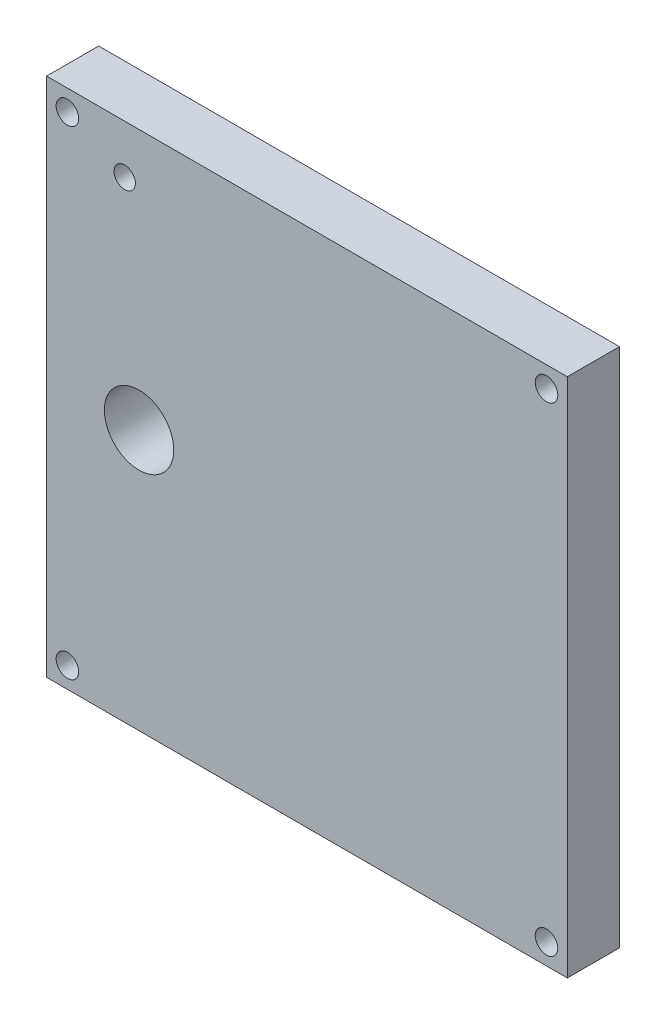
ISO-10303-21;
HEADER;
FILE_DESCRIPTION(('STEP AP214'),'2;1');
FILE_NAME('part.step','',(''),(''),'','','');
FILE_SCHEMA(('AUTOMOTIVE_DESIGN { 1 0 10303 214 1 1 1 1 }'));
ENDSEC;
DATA;
#1=APPLICATION_CONTEXT('core data for automotive mechanical design processes');
#2=APPLICATION_PROTOCOL_DEFINITION('international standard','automotive_design',2000,#1);
#3=PRODUCT_CONTEXT('',#1,'mechanical');
#4=PRODUCT('Part','Part','',(#3));
#5=PRODUCT_RELATED_PRODUCT_CATEGORY('part','',(#4));
#6=PRODUCT_DEFINITION_FORMATION('','',#4);
#7=PRODUCT_DEFINITION_CONTEXT('part definition',#1,'design');
#8=PRODUCT_DEFINITION('design','',#6,#7);
#9=PRODUCT_DEFINITION_SHAPE('','',#8);
#10=(LENGTH_UNIT() NAMED_UNIT(*) SI_UNIT(.MILLI.,.METRE.));
#11=(NAMED_UNIT(*) PLANE_ANGLE_UNIT() SI_UNIT($,.RADIAN.));
#12=(NAMED_UNIT(*) SI_UNIT($,.STERADIAN.) SOLID_ANGLE_UNIT());
#13=UNCERTAINTY_MEASURE_WITH_UNIT(LENGTH_MEASURE(1.E-05),#10,'distance_accuracy_value','');
#14=(GEOMETRIC_REPRESENTATION_CONTEXT(3) GLOBAL_UNCERTAINTY_ASSIGNED_CONTEXT((#13)) GLOBAL_UNIT_ASSIGNED_CONTEXT((#10,
#11,#12)) REPRESENTATION_CONTEXT('',''));
#15=CARTESIAN_POINT('',(0.,0.,0.));
#16=DIRECTION('',(0.,0.,1.));
#17=DIRECTION('',(1.,0.,0.));
#18=AXIS2_PLACEMENT_3D('',#15,#16,#17);
#19=CARTESIAN_POINT('',(75.,75.,7.5));
#20=DIRECTION('',(-1.,0.,0.));
#21=DIRECTION('',(0.,-1.,0.));
#22=AXIS2_PLACEMENT_3D('',#19,#20,#21);
#23=PLANE('',#22);
#24=DIRECTION('',(0.,1.,0.));
#25=VECTOR('',#24,1.);
#26=CARTESIAN_POINT('',(75.,75.,-7.5));
#27=LINE('',#26,#25);
#28=CARTESIAN_POINT('',(75.,-75.,-7.5));
#29=VERTEX_POINT('',#28);
#30=CARTESIAN_POINT('',(75.,75.,-7.5));
#31=VERTEX_POINT('',#30);
#32=EDGE_CURVE('E97',#29,#31,#27,.T.);
#33=ORIENTED_EDGE('',*,*,#32,.T.);
#34=DIRECTION('',(0.,0.,-1.));
#35=VECTOR('',#34,1.);
#36=CARTESIAN_POINT('',(75.,75.,7.5));
#37=LINE('',#36,#35);
#38=CARTESIAN_POINT('',(75.,75.,7.5));
#39=VERTEX_POINT('',#38);
#40=EDGE_CURVE('E11',#39,#31,#37,.T.);
#41=ORIENTED_EDGE('',*,*,#40,.F.);
#42=DIRECTION('',(0.,1.,0.));
#43=VECTOR('',#42,1.);
#44=CARTESIAN_POINT('',(75.,75.,7.5));
#45=LINE('',#44,#43);
#46=CARTESIAN_POINT('',(75.,-75.,7.5));
#47=VERTEX_POINT('',#46);
#48=EDGE_CURVE('E84',#47,#39,#45,.T.);
#49=ORIENTED_EDGE('',*,*,#48,.F.);
#50=DIRECTION('',(0.,0.,-1.));
#51=VECTOR('',#50,1.);
#52=CARTESIAN_POINT('',(75.,-75.,7.5));
#53=LINE('',#52,#51);
#54=EDGE_CURVE('E93',#47,#29,#53,.T.);
#55=ORIENTED_EDGE('',*,*,#54,.T.);
#56=EDGE_LOOP('',(#33,#41,#49,#55));
#57=FACE_BOUND('',#56,.T.);
#58=ADVANCED_FACE('F32',(#57),#23,.F.);
#59=CARTESIAN_POINT('',(-75.,75.,7.5));
#60=DIRECTION('',(0.,-1.,0.));
#61=DIRECTION('',(0.,0.,-1.));
#62=AXIS2_PLACEMENT_3D('',#59,#60,#61);
#63=PLANE('',#62);
#64=DIRECTION('',(-1.,0.,0.));
#65=VECTOR('',#64,1.);
#66=CARTESIAN_POINT('',(-75.,75.,-7.5));
#67=LINE('',#66,#65);
#68=CARTESIAN_POINT('',(-75.,75.,-7.5));
#69=VERTEX_POINT('',#68);
#70=EDGE_CURVE('E88',#31,#69,#67,.T.);
#71=ORIENTED_EDGE('',*,*,#70,.T.);
#72=DIRECTION('',(0.,0.,-1.));
#73=VECTOR('',#72,1.);
#74=CARTESIAN_POINT('',(-75.,75.,7.5));
#75=LINE('',#74,#73);
#76=CARTESIAN_POINT('',(-75.,75.,7.5));
#77=VERTEX_POINT('',#76);
#78=EDGE_CURVE('E41',#77,#69,#75,.T.);
#79=ORIENTED_EDGE('',*,*,#78,.F.);
#80=DIRECTION('',(-1.,0.,0.));
#81=VECTOR('',#80,1.);
#82=CARTESIAN_POINT('',(-75.,75.,7.5));
#83=LINE('',#82,#81);
#84=EDGE_CURVE('E79',#39,#77,#83,.T.);
#85=ORIENTED_EDGE('',*,*,#84,.F.);
#86=ORIENTED_EDGE('',*,*,#40,.T.);
#87=EDGE_LOOP('',(#71,#79,#85,#86));
#88=FACE_BOUND('',#87,.T.);
#89=ADVANCED_FACE('F87',(#88),#63,.F.);
#90=CARTESIAN_POINT('',(-75.,75.,7.5));
#91=DIRECTION('',(1.,0.,0.));
#92=DIRECTION('',(0.,1.,0.));
#93=AXIS2_PLACEMENT_3D('',#90,#91,#92);
#94=PLANE('',#93);
#95=DIRECTION('',(0.,-1.,0.));
#96=VECTOR('',#95,1.);
#97=CARTESIAN_POINT('',(-75.,75.,-7.5));
#98=LINE('',#97,#96);
#99=CARTESIAN_POINT('',(-75.,-75.,-7.5));
#100=VERTEX_POINT('',#99);
#101=EDGE_CURVE('E66',#69,#100,#98,.T.);
#102=ORIENTED_EDGE('',*,*,#101,.T.);
#103=DIRECTION('',(0.,0.,-1.));
#104=VECTOR('',#103,1.);
#105=CARTESIAN_POINT('',(-75.,-75.,7.5));
#106=LINE('',#105,#104);
#107=CARTESIAN_POINT('',(-75.,-75.,7.5));
#108=VERTEX_POINT('',#107);
#109=EDGE_CURVE('E89',#108,#100,#106,.T.);
#110=ORIENTED_EDGE('',*,*,#109,.F.);
#111=DIRECTION('',(0.,-1.,0.));
#112=VECTOR('',#111,1.);
#113=CARTESIAN_POINT('',(-75.,75.,7.5));
#114=LINE('',#113,#112);
#115=EDGE_CURVE('E82',#77,#108,#114,.T.);
#116=ORIENTED_EDGE('',*,*,#115,.F.);
#117=ORIENTED_EDGE('',*,*,#78,.T.);
#118=EDGE_LOOP('',(#102,#110,#116,#117));
#119=FACE_BOUND('',#118,.T.);
#120=ADVANCED_FACE('F91',(#119),#94,.F.);
#121=CARTESIAN_POINT('',(-75.,-75.,7.5));
#122=DIRECTION('',(0.,1.,0.));
#123=DIRECTION('',(0.,0.,1.));
#124=AXIS2_PLACEMENT_3D('',#121,#122,#123);
#125=PLANE('',#124);
#126=DIRECTION('',(1.,0.,0.));
#127=VECTOR('',#126,1.);
#128=CARTESIAN_POINT('',(-75.,-75.,-7.5));
#129=LINE('',#128,#127);
#130=EDGE_CURVE('E72',#100,#29,#129,.T.);
#131=ORIENTED_EDGE('',*,*,#130,.T.);
#132=ORIENTED_EDGE('',*,*,#54,.F.);
#133=DIRECTION('',(1.,0.,0.));
#134=VECTOR('',#133,1.);
#135=CARTESIAN_POINT('',(-75.,-75.,7.5));
#136=LINE('',#135,#134);
#137=EDGE_CURVE('E49',#108,#47,#136,.T.);
#138=ORIENTED_EDGE('',*,*,#137,.F.);
#139=ORIENTED_EDGE('',*,*,#109,.T.);
#140=EDGE_LOOP('',(#131,#132,#138,#139));
#141=FACE_BOUND('',#140,.T.);
#142=ADVANCED_FACE('F105',(#141),#125,.F.);
#143=CARTESIAN_POINT('',(0.,0.,7.5));
#144=DIRECTION('',(0.,0.,1.));
#145=DIRECTION('',(1.,0.,0.));
#146=AXIS2_PLACEMENT_3D('',#143,#144,#145);
#147=PLANE('',#146);
#148=CARTESIAN_POINT('',(69.,69.,7.5));
#149=DIRECTION('',(0.,0.,1.));
#150=DIRECTION('',(1.,0.,0.));
#151=AXIS2_PLACEMENT_3D('',#148,#149,#150);
#152=CIRCLE('',#151,3.25000000000001);
#153=CARTESIAN_POINT('',(72.25,69.,7.5));
#154=VERTEX_POINT('',#153);
#155=EDGE_CURVE('E137',#154,#154,#152,.F.);
#156=ORIENTED_EDGE('',*,*,#155,.T.);
#157=EDGE_LOOP('',(#156));
#158=FACE_BOUND('',#157,.T.);
#159=CARTESIAN_POINT('',(69.,-69.,7.5));
#160=DIRECTION('',(0.,0.,1.));
#161=DIRECTION('',(1.,0.,0.));
#162=AXIS2_PLACEMENT_3D('',#159,#160,#161);
#163=CIRCLE('',#162,3.25000000000001);
#164=CARTESIAN_POINT('',(72.25,-69.,7.5));
#165=VERTEX_POINT('',#164);
#166=EDGE_CURVE('E131',#165,#165,#163,.T.);
#167=ORIENTED_EDGE('',*,*,#166,.F.);
#168=EDGE_LOOP('',(#167));
#169=FACE_BOUND('',#168,.T.);
#170=CARTESIAN_POINT('',(-69.,-69.,7.5));
#171=DIRECTION('',(0.,0.,1.));
#172=DIRECTION('',(1.,0.,0.));
#173=AXIS2_PLACEMENT_3D('',#170,#171,#172);
#174=CIRCLE('',#173,3.25000000000001);
#175=CARTESIAN_POINT('',(-65.75,-69.,7.5));
#176=VERTEX_POINT('',#175);
#177=EDGE_CURVE('E125',#176,#176,#174,.F.);
#178=ORIENTED_EDGE('',*,*,#177,.T.);
#179=EDGE_LOOP('',(#178));
#180=FACE_BOUND('',#179,.T.);
#181=CARTESIAN_POINT('',(-69.,69.,7.5));
#182=DIRECTION('',(0.,0.,1.));
#183=DIRECTION('',(1.,0.,0.));
#184=AXIS2_PLACEMENT_3D('',#181,#182,#183);
#185=CIRCLE('',#184,3.25000000000001);
#186=CARTESIAN_POINT('',(-65.75,69.,7.5));
#187=VERTEX_POINT('',#186);
#188=EDGE_CURVE('E119',#187,#187,#185,.T.);
#189=ORIENTED_EDGE('',*,*,#188,.F.);
#190=EDGE_LOOP('',(#189));
#191=FACE_BOUND('',#190,.T.);
#192=CARTESIAN_POINT('',(-48.3691097361927,0.,7.5));
#193=DIRECTION('',(0.,0.,1.));
#194=DIRECTION('',(1.,0.,0.));
#195=AXIS2_PLACEMENT_3D('',#192,#193,#194);
#196=CIRCLE('',#195,10.);
#197=CARTESIAN_POINT('',(-38.3691097361927,0.,7.5));
#198=VERTEX_POINT('',#197);
#199=EDGE_CURVE('E116',#198,#198,#196,.T.);
#200=ORIENTED_EDGE('',*,*,#199,.F.);
#201=EDGE_LOOP('',(#200));
#202=FACE_BOUND('',#201,.T.);
#203=CARTESIAN_POINT('',(-52.5,61.,7.5));
#204=DIRECTION('',(0.,0.,1.));
#205=DIRECTION('',(1.,0.,0.));
#206=AXIS2_PLACEMENT_3D('',#203,#204,#205);
#207=CIRCLE('',#206,3.075);
#208=CARTESIAN_POINT('',(-49.425,61.,7.5));
#209=VERTEX_POINT('',#208);
#210=EDGE_CURVE('E100',#209,#209,#207,.T.);
#211=ORIENTED_EDGE('',*,*,#210,.F.);
#212=EDGE_LOOP('',(#211));
#213=FACE_BOUND('',#212,.T.);
#214=ORIENTED_EDGE('',*,*,#48,.T.);
#215=ORIENTED_EDGE('',*,*,#84,.T.);
#216=ORIENTED_EDGE('',*,*,#115,.T.);
#217=ORIENTED_EDGE('',*,*,#137,.T.);
#218=EDGE_LOOP('',(#214,#215,#216,#217));
#219=FACE_BOUND('',#218,.T.);
#220=ADVANCED_FACE('F80',(#158,#169,#180,#191,#202,#213,#219),#147,.T.);
#221=CARTESIAN_POINT('',(0.,0.,-7.5));
#222=DIRECTION('',(0.,0.,1.));
#223=DIRECTION('',(1.,0.,0.));
#224=AXIS2_PLACEMENT_3D('',#221,#222,#223);
#225=PLANE('',#224);
#226=CARTESIAN_POINT('',(69.,69.,-7.5));
#227=DIRECTION('',(0.,0.,1.));
#228=DIRECTION('',(1.,0.,0.));
#229=AXIS2_PLACEMENT_3D('',#226,#227,#228);
#230=CIRCLE('',#229,3.25000000000001);
#231=CARTESIAN_POINT('',(72.25,69.,-7.5));
#232=VERTEX_POINT('',#231);
#233=EDGE_CURVE('E140',#232,#232,#230,.T.);
#234=ORIENTED_EDGE('',*,*,#233,.T.);
#235=EDGE_LOOP('',(#234));
#236=FACE_BOUND('',#235,.T.);
#237=CARTESIAN_POINT('',(69.,-69.,-7.5));
#238=DIRECTION('',(0.,0.,-1.));
#239=DIRECTION('',(1.,0.,0.));
#240=AXIS2_PLACEMENT_3D('',#237,#238,#239);
#241=CIRCLE('',#240,3.25000000000001);
#242=CARTESIAN_POINT('',(72.25,-69.,-7.5));
#243=VERTEX_POINT('',#242);
#244=EDGE_CURVE('E134',#243,#243,#241,.T.);
#245=ORIENTED_EDGE('',*,*,#244,.F.);
#246=EDGE_LOOP('',(#245));
#247=FACE_BOUND('',#246,.T.);
#248=CARTESIAN_POINT('',(-69.,-69.,-7.5));
#249=DIRECTION('',(0.,0.,1.));
#250=DIRECTION('',(-1.,0.,0.));
#251=AXIS2_PLACEMENT_3D('',#248,#249,#250);
#252=CIRCLE('',#251,3.25000000000001);
#253=CARTESIAN_POINT('',(-72.25,-69.,-7.5));
#254=VERTEX_POINT('',#253);
#255=EDGE_CURVE('E128',#254,#254,#252,.T.);
#256=ORIENTED_EDGE('',*,*,#255,.T.);
#257=EDGE_LOOP('',(#256));
#258=FACE_BOUND('',#257,.T.);
#259=CARTESIAN_POINT('',(-69.,69.,-7.5));
#260=DIRECTION('',(0.,0.,-1.));
#261=DIRECTION('',(-1.,0.,0.));
#262=AXIS2_PLACEMENT_3D('',#259,#260,#261);
#263=CIRCLE('',#262,3.25000000000001);
#264=CARTESIAN_POINT('',(-72.25,69.,-7.5));
#265=VERTEX_POINT('',#264);
#266=EDGE_CURVE('E122',#265,#265,#263,.T.);
#267=ORIENTED_EDGE('',*,*,#266,.F.);
#268=EDGE_LOOP('',(#267));
#269=FACE_BOUND('',#268,.T.);
#270=CARTESIAN_POINT('',(-48.3691097361927,0.,-7.5));
#271=DIRECTION('',(0.,0.,1.));
#272=DIRECTION('',(1.,0.,0.));
#273=AXIS2_PLACEMENT_3D('',#270,#271,#272);
#274=CIRCLE('',#273,10.);
#275=CARTESIAN_POINT('',(-38.3691097361927,0.,-7.5));
#276=VERTEX_POINT('',#275);
#277=EDGE_CURVE('E35',#276,#276,#274,.T.);
#278=ORIENTED_EDGE('',*,*,#277,.T.);
#279=EDGE_LOOP('',(#278));
#280=FACE_BOUND('',#279,.T.);
#281=CARTESIAN_POINT('',(-52.5,61.,-7.5));
#282=DIRECTION('',(0.,0.,-1.));
#283=DIRECTION('',(-1.,0.,0.));
#284=AXIS2_PLACEMENT_3D('',#281,#282,#283);
#285=CIRCLE('',#284,3.075);
#286=CARTESIAN_POINT('',(-55.575,61.,-7.5));
#287=VERTEX_POINT('',#286);
#288=EDGE_CURVE('E113',#287,#287,#285,.T.);
#289=ORIENTED_EDGE('',*,*,#288,.F.);
#290=EDGE_LOOP('',(#289));
#291=FACE_BOUND('',#290,.T.);
#292=ORIENTED_EDGE('',*,*,#32,.F.);
#293=ORIENTED_EDGE('',*,*,#130,.F.);
#294=ORIENTED_EDGE('',*,*,#101,.F.);
#295=ORIENTED_EDGE('',*,*,#70,.F.);
#296=EDGE_LOOP('',(#292,#293,#294,#295));
#297=FACE_BOUND('',#296,.T.);
#298=ADVANCED_FACE('F108',(#236,#247,#258,#269,#280,#291,#297),#225,.F.);
#299=CARTESIAN_POINT('',(-52.5,61.,24.5));
#300=DIRECTION('',(0.,0.,-1.));
#301=DIRECTION('',(-1.,0.,0.));
#302=AXIS2_PLACEMENT_3D('',#299,#300,#301);
#303=CYLINDRICAL_SURFACE('',#302,3.075);
#304=ORIENTED_EDGE('',*,*,#210,.T.);
#305=EDGE_LOOP('',(#304));
#306=FACE_BOUND('',#305,.T.);
#307=ORIENTED_EDGE('',*,*,#288,.T.);
#308=EDGE_LOOP('',(#307));
#309=FACE_BOUND('',#308,.T.);
#310=ADVANCED_FACE('F171',(#306,#309),#303,.F.);
#311=CARTESIAN_POINT('',(-48.3691097361927,0.,-14.5));
#312=DIRECTION('',(0.,0.,1.));
#313=DIRECTION('',(1.,0.,0.));
#314=AXIS2_PLACEMENT_3D('',#311,#312,#313);
#315=CYLINDRICAL_SURFACE('',#314,10.);
#316=ORIENTED_EDGE('',*,*,#199,.T.);
#317=EDGE_LOOP('',(#316));
#318=FACE_BOUND('',#317,.T.);
#319=ORIENTED_EDGE('',*,*,#277,.F.);
#320=EDGE_LOOP('',(#319));
#321=FACE_BOUND('',#320,.T.);
#322=ADVANCED_FACE('F177',(#318,#321),#315,.F.);
#323=CARTESIAN_POINT('',(-69.,69.,14.5));
#324=DIRECTION('',(0.,0.,-1.));
#325=DIRECTION('',(-1.,0.,0.));
#326=AXIS2_PLACEMENT_3D('',#323,#324,#325);
#327=CYLINDRICAL_SURFACE('',#326,3.25000000000001);
#328=ORIENTED_EDGE('',*,*,#188,.T.);
#329=EDGE_LOOP('',(#328));
#330=FACE_BOUND('',#329,.T.);
#331=ORIENTED_EDGE('',*,*,#266,.T.);
#332=EDGE_LOOP('',(#331));
#333=FACE_BOUND('',#332,.T.);
#334=ADVANCED_FACE('F181',(#330,#333),#327,.F.);
#335=CARTESIAN_POINT('',(-69.,-69.,14.5));
#336=DIRECTION('',(0.,0.,-1.));
#337=DIRECTION('',(-1.,0.,0.));
#338=AXIS2_PLACEMENT_3D('',#335,#336,#337);
#339=CYLINDRICAL_SURFACE('',#338,3.25000000000001);
#340=ORIENTED_EDGE('',*,*,#177,.F.);
#341=EDGE_LOOP('',(#340));
#342=FACE_BOUND('',#341,.T.);
#343=ORIENTED_EDGE('',*,*,#255,.F.);
#344=EDGE_LOOP('',(#343));
#345=FACE_BOUND('',#344,.T.);
#346=ADVANCED_FACE('F154',(#342,#345),#339,.F.);
#347=CARTESIAN_POINT('',(69.,-69.,14.5));
#348=DIRECTION('',(0.,0.,-1.));
#349=DIRECTION('',(-1.,0.,0.));
#350=AXIS2_PLACEMENT_3D('',#347,#348,#349);
#351=CYLINDRICAL_SURFACE('',#350,3.25000000000001);
#352=ORIENTED_EDGE('',*,*,#166,.T.);
#353=EDGE_LOOP('',(#352));
#354=FACE_BOUND('',#353,.T.);
#355=ORIENTED_EDGE('',*,*,#244,.T.);
#356=EDGE_LOOP('',(#355));
#357=FACE_BOUND('',#356,.T.);
#358=ADVANCED_FACE('F148',(#354,#357),#351,.F.);
#359=CARTESIAN_POINT('',(69.,69.,14.5));
#360=DIRECTION('',(0.,0.,-1.));
#361=DIRECTION('',(-1.,0.,0.));
#362=AXIS2_PLACEMENT_3D('',#359,#360,#361);
#363=CYLINDRICAL_SURFACE('',#362,3.25000000000001);
#364=ORIENTED_EDGE('',*,*,#155,.F.);
#365=EDGE_LOOP('',(#364));
#366=FACE_BOUND('',#365,.T.);
#367=ORIENTED_EDGE('',*,*,#233,.F.);
#368=EDGE_LOOP('',(#367));
#369=FACE_BOUND('',#368,.T.);
#370=ADVANCED_FACE('F146',(#366,#369),#363,.F.);
#371=CLOSED_SHELL('',(#58,#89,#120,#142,#220,#298,#310,#322,#334,#346,#358,#370));
#372=MANIFOLD_SOLID_BREP('B2',#371);
#373=ADVANCED_BREP_SHAPE_REPRESENTATION('',(#18,#372),#14);
#374=SHAPE_DEFINITION_REPRESENTATION(#9,#373);
ENDSEC;
END-ISO-10303-21;
